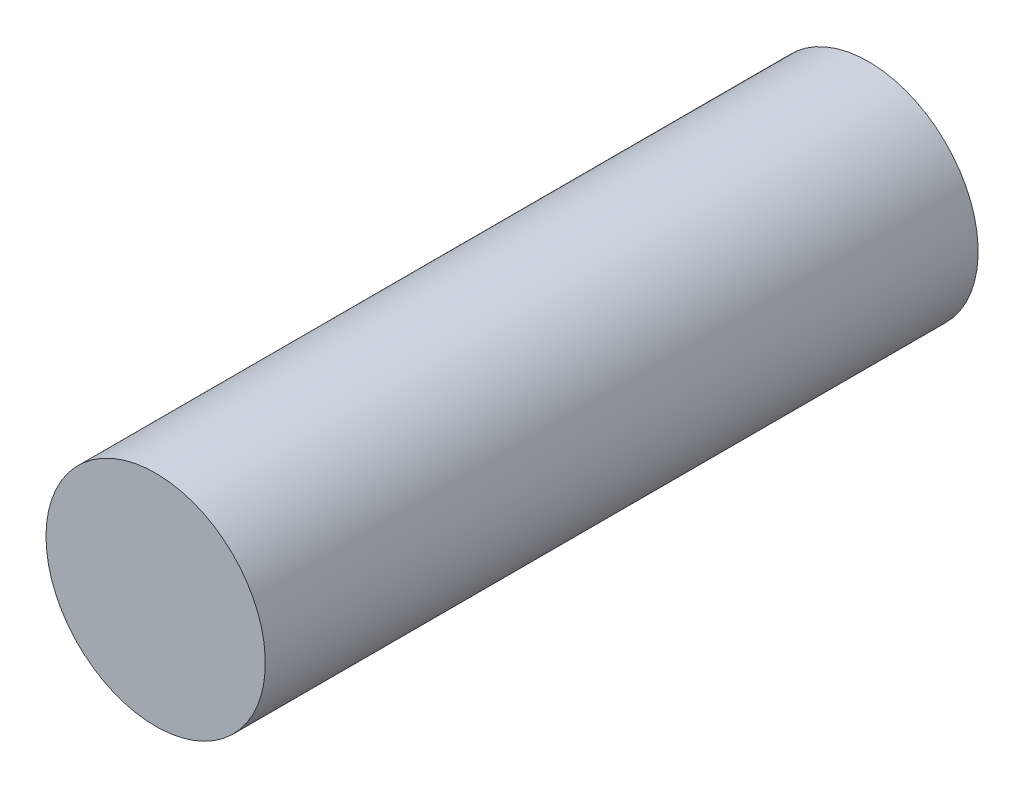
ISO-10303-21;
HEADER;
FILE_DESCRIPTION(('STEP AP214'),'2;1');
FILE_NAME('part.step','',(''),(''),'','','');
FILE_SCHEMA(('AUTOMOTIVE_DESIGN { 1 0 10303 214 1 1 1 1 }'));
ENDSEC;
DATA;
#1=APPLICATION_CONTEXT('core data for automotive mechanical design processes');
#2=APPLICATION_PROTOCOL_DEFINITION('international standard','automotive_design',2000,#1);
#3=PRODUCT_CONTEXT('',#1,'mechanical');
#4=PRODUCT('Part','Part','',(#3));
#5=PRODUCT_RELATED_PRODUCT_CATEGORY('part','',(#4));
#6=PRODUCT_DEFINITION_FORMATION('','',#4);
#7=PRODUCT_DEFINITION_CONTEXT('part definition',#1,'design');
#8=PRODUCT_DEFINITION('design','',#6,#7);
#9=PRODUCT_DEFINITION_SHAPE('','',#8);
#10=(LENGTH_UNIT() NAMED_UNIT(*) SI_UNIT(.MILLI.,.METRE.));
#11=(NAMED_UNIT(*) PLANE_ANGLE_UNIT() SI_UNIT($,.RADIAN.));
#12=(NAMED_UNIT(*) SI_UNIT($,.STERADIAN.) SOLID_ANGLE_UNIT());
#13=UNCERTAINTY_MEASURE_WITH_UNIT(LENGTH_MEASURE(1.E-05),#10,'distance_accuracy_value','');
#14=(GEOMETRIC_REPRESENTATION_CONTEXT(3) GLOBAL_UNCERTAINTY_ASSIGNED_CONTEXT((#13)) GLOBAL_UNIT_ASSIGNED_CONTEXT((#10,
#11,#12)) REPRESENTATION_CONTEXT('',''));
#15=CARTESIAN_POINT('',(0.,0.,0.));
#16=DIRECTION('',(0.,0.,1.));
#17=DIRECTION('',(1.,0.,0.));
#18=AXIS2_PLACEMENT_3D('',#15,#16,#17);
#19=CARTESIAN_POINT('',(0.,0.,52.));
#20=DIRECTION('',(0.,0.,-1.));
#21=DIRECTION('',(-1.,0.,0.));
#22=AXIS2_PLACEMENT_3D('',#19,#20,#21);
#23=CYLINDRICAL_SURFACE('',#22,8.);
#24=CARTESIAN_POINT('',(0.,0.,52.));
#25=DIRECTION('',(0.,0.,1.));
#26=DIRECTION('',(1.,0.,0.));
#27=AXIS2_PLACEMENT_3D('',#24,#25,#26);
#28=CIRCLE('',#27,8.);
#29=CARTESIAN_POINT('',(-8.,0.,52.));
#30=VERTEX_POINT('',#29);
#31=EDGE_CURVE('E10',#30,#30,#28,.T.);
#32=CARTESIAN_POINT('',(0.,0.,0.));
#33=DIRECTION('',(0.,0.,1.));
#34=DIRECTION('',(1.,0.,0.));
#35=AXIS2_PLACEMENT_3D('',#32,#33,#34);
#36=CIRCLE('',#35,8.);
#37=CARTESIAN_POINT('',(-8.,0.,0.));
#38=VERTEX_POINT('',#37);
#39=EDGE_CURVE('E40',#38,#38,#36,.T.);
#40=CARTESIAN_POINT('',(-8.,0.,52.));
#41=CARTESIAN_POINT('',(-8.,0.,51.4583333333333));
#42=CARTESIAN_POINT('',(-8.,0.,50.9166666666667));
#43=CARTESIAN_POINT('',(-8.,0.,49.8333333333333));
#44=CARTESIAN_POINT('',(-8.,0.,49.2916666666667));
#45=CARTESIAN_POINT('',(-8.,0.,48.2083333333333));
#46=CARTESIAN_POINT('',(-8.,0.,47.6666666666667));
#47=CARTESIAN_POINT('',(-8.,0.,46.5833333333333));
#48=CARTESIAN_POINT('',(-8.,0.,46.0416666666667));
#49=CARTESIAN_POINT('',(-8.,0.,44.9583333333333));
#50=CARTESIAN_POINT('',(-8.,0.,44.4166666666667));
#51=CARTESIAN_POINT('',(-8.,0.,43.3333333333333));
#52=CARTESIAN_POINT('',(-8.,0.,42.7916666666667));
#53=CARTESIAN_POINT('',(-8.,0.,41.7083333333333));
#54=CARTESIAN_POINT('',(-8.,0.,41.1666666666667));
#55=CARTESIAN_POINT('',(-8.,0.,40.0833333333333));
#56=CARTESIAN_POINT('',(-8.,0.,39.5416666666667));
#57=CARTESIAN_POINT('',(-8.,0.,38.4583333333333));
#58=CARTESIAN_POINT('',(-8.,0.,37.9166666666667));
#59=CARTESIAN_POINT('',(-8.,0.,36.8333333333333));
#60=CARTESIAN_POINT('',(-8.,0.,36.2916666666667));
#61=CARTESIAN_POINT('',(-8.,0.,35.2083333333333));
#62=CARTESIAN_POINT('',(-8.,0.,34.6666666666667));
#63=CARTESIAN_POINT('',(-8.,0.,33.5833333333333));
#64=CARTESIAN_POINT('',(-8.,0.,33.0416666666667));
#65=CARTESIAN_POINT('',(-8.,0.,31.9583333333333));
#66=CARTESIAN_POINT('',(-8.,0.,31.4166666666667));
#67=CARTESIAN_POINT('',(-8.,0.,30.3333333333333));
#68=CARTESIAN_POINT('',(-8.,0.,29.7916666666667));
#69=CARTESIAN_POINT('',(-8.,0.,28.7083333333333));
#70=CARTESIAN_POINT('',(-8.,0.,28.1666666666667));
#71=CARTESIAN_POINT('',(-8.,0.,27.0833333333333));
#72=CARTESIAN_POINT('',(-8.,0.,26.5416666666667));
#73=CARTESIAN_POINT('',(-8.,0.,25.4583333333333));
#74=CARTESIAN_POINT('',(-8.,0.,24.9166666666667));
#75=CARTESIAN_POINT('',(-8.,0.,23.8333333333333));
#76=CARTESIAN_POINT('',(-8.,0.,23.2916666666667));
#77=CARTESIAN_POINT('',(-8.,0.,22.2083333333333));
#78=CARTESIAN_POINT('',(-8.,0.,21.6666666666667));
#79=CARTESIAN_POINT('',(-8.,0.,20.5833333333333));
#80=CARTESIAN_POINT('',(-8.,0.,20.0416666666667));
#81=CARTESIAN_POINT('',(-8.,0.,18.9583333333333));
#82=CARTESIAN_POINT('',(-8.,0.,18.4166666666667));
#83=CARTESIAN_POINT('',(-8.,0.,17.3333333333333));
#84=CARTESIAN_POINT('',(-8.,0.,16.7916666666667));
#85=CARTESIAN_POINT('',(-8.,0.,15.7083333333333));
#86=CARTESIAN_POINT('',(-8.,0.,15.1666666666667));
#87=CARTESIAN_POINT('',(-8.,0.,14.0833333333333));
#88=CARTESIAN_POINT('',(-8.,0.,13.5416666666667));
#89=CARTESIAN_POINT('',(-8.,0.,12.4583333333333));
#90=CARTESIAN_POINT('',(-8.,0.,11.9166666666667));
#91=CARTESIAN_POINT('',(-8.,0.,10.8333333333333));
#92=CARTESIAN_POINT('',(-8.,0.,10.2916666666667));
#93=CARTESIAN_POINT('',(-8.,0.,9.20833333333333));
#94=CARTESIAN_POINT('',(-8.,0.,8.66666666666667));
#95=CARTESIAN_POINT('',(-8.,0.,7.58333333333333));
#96=CARTESIAN_POINT('',(-8.,0.,7.04166666666667));
#97=CARTESIAN_POINT('',(-8.,0.,5.95833333333333));
#98=CARTESIAN_POINT('',(-8.,0.,5.41666666666667));
#99=CARTESIAN_POINT('',(-8.,0.,4.33333333333333));
#100=CARTESIAN_POINT('',(-8.,0.,3.79166666666667));
#101=CARTESIAN_POINT('',(-8.,0.,2.70833333333334));
#102=CARTESIAN_POINT('',(-8.,0.,2.16666666666667));
#103=CARTESIAN_POINT('',(-8.,0.,1.08333333333333));
#104=CARTESIAN_POINT('',(-8.,0.,0.541666666666667));
#105=CARTESIAN_POINT('',(-8.,0.,0.));
#106=B_SPLINE_CURVE_WITH_KNOTS('',3,(#40,#41,#42,#43,#44,#45,#46,#47,#48,#49,#50,#51,#52,#53,
#54,#55,#56,#57,#58,#59,#60,#61,#62,#63,#64,#65,#66,#67,#68,#69,#70,#71,#72,#73,#74,#75,#76,#77,
#78,#79,#80,#81,#82,#83,#84,#85,#86,#87,#88,#89,#90,#91,#92,#93,#94,#95,#96,#97,#98,#99,#100,
#101,#102,#103,#104,#105),.UNSPECIFIED.,.F.,.F.,(4,2,2,2,2,2,2,2,2,2,2,2,2,2,2,2,2,2,2,2,2,2,2,
2,2,2,2,2,2,2,2,2,4),(0.,1.625,3.25,4.875,6.50000000000001,8.125,9.75,11.375,13.,14.625,16.25,
17.875,19.5,21.125,22.75,24.375,26.,27.625,29.25,30.875,32.5,34.125,35.75,37.375,39.,40.625,
42.25,43.875,45.5,47.125,48.75,50.375,52.),.UNSPECIFIED.);
#107=EDGE_CURVE('BSEAM37',#30,#38,#106,.T.);
#108=ORIENTED_EDGE('',*,*,#31,.F.);
#109=ORIENTED_EDGE('',*,*,#39,.T.);
#110=ORIENTED_EDGE('',*,*,#107,.T.);
#111=ORIENTED_EDGE('',*,*,#107,.F.);
#112=EDGE_LOOP('',(#108,#110,#109,#111));
#113=FACE_BOUND('',#112,.T.);
#114=ADVANCED_FACE('F37',(#113),#23,.T.);
#115=CARTESIAN_POINT('',(0.,0.,52.));
#116=DIRECTION('',(0.,0.,1.));
#117=DIRECTION('',(1.,0.,0.));
#118=AXIS2_PLACEMENT_3D('',#115,#116,#117);
#119=PLANE('',#118);
#120=ORIENTED_EDGE('',*,*,#31,.T.);
#121=EDGE_LOOP('',(#120));
#122=FACE_BOUND('',#121,.T.);
#123=ADVANCED_FACE('F52',(#122),#119,.T.);
#124=CARTESIAN_POINT('',(0.,0.,0.));
#125=DIRECTION('',(0.,0.,1.));
#126=DIRECTION('',(1.,0.,0.));
#127=AXIS2_PLACEMENT_3D('',#124,#125,#126);
#128=PLANE('',#127);
#129=ORIENTED_EDGE('',*,*,#39,.F.);
#130=EDGE_LOOP('',(#129));
#131=FACE_BOUND('',#130,.T.);
#132=ADVANCED_FACE('F50',(#131),#128,.F.);
#133=CLOSED_SHELL('',(#114,#123,#132));
#134=MANIFOLD_SOLID_BREP('B2',#133);
#135=ADVANCED_BREP_SHAPE_REPRESENTATION('',(#18,#134),#14);
#136=SHAPE_DEFINITION_REPRESENTATION(#9,#135);
ENDSEC;
END-ISO-10303-21;
